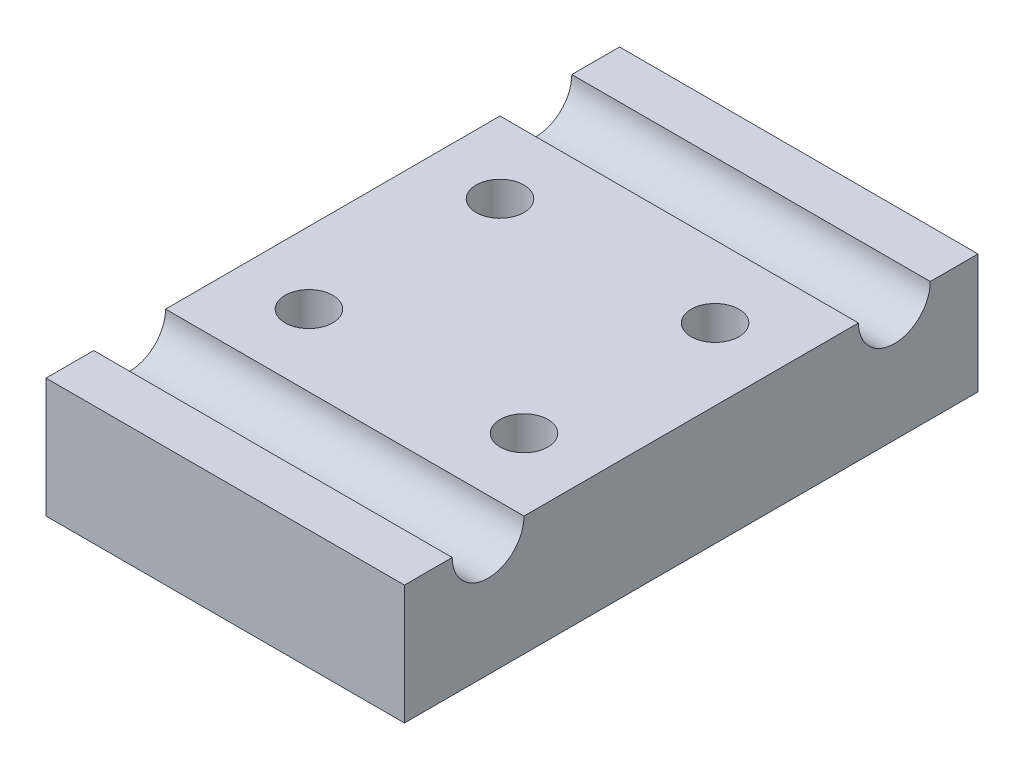
ISO-10303-21;
HEADER;
FILE_DESCRIPTION(('STEP AP214'),'2;1');
FILE_NAME('part.step','',(''),(''),'','','');
FILE_SCHEMA(('AUTOMOTIVE_DESIGN { 1 0 10303 214 1 1 1 1 }'));
ENDSEC;
DATA;
#1=APPLICATION_CONTEXT('core data for automotive mechanical design processes');
#2=APPLICATION_PROTOCOL_DEFINITION('international standard','automotive_design',2000,#1);
#3=PRODUCT_CONTEXT('',#1,'mechanical');
#4=PRODUCT('Part','Part','',(#3));
#5=PRODUCT_RELATED_PRODUCT_CATEGORY('part','',(#4));
#6=PRODUCT_DEFINITION_FORMATION('','',#4);
#7=PRODUCT_DEFINITION_CONTEXT('part definition',#1,'design');
#8=PRODUCT_DEFINITION('design','',#6,#7);
#9=PRODUCT_DEFINITION_SHAPE('','',#8);
#10=(LENGTH_UNIT() NAMED_UNIT(*) SI_UNIT(.MILLI.,.METRE.));
#11=(NAMED_UNIT(*) PLANE_ANGLE_UNIT() SI_UNIT($,.RADIAN.));
#12=(NAMED_UNIT(*) SI_UNIT($,.STERADIAN.) SOLID_ANGLE_UNIT());
#13=UNCERTAINTY_MEASURE_WITH_UNIT(LENGTH_MEASURE(1.E-05),#10,'distance_accuracy_value','');
#14=(GEOMETRIC_REPRESENTATION_CONTEXT(3) GLOBAL_UNCERTAINTY_ASSIGNED_CONTEXT((#13)) GLOBAL_UNIT_ASSIGNED_CONTEXT((#10,
#11,#12)) REPRESENTATION_CONTEXT('',''));
#15=CARTESIAN_POINT('',(0.,0.,0.));
#16=DIRECTION('',(0.,0.,1.));
#17=DIRECTION('',(1.,0.,0.));
#18=AXIS2_PLACEMENT_3D('',#15,#16,#17);
#19=CARTESIAN_POINT('',(0.,10.,48.));
#20=DIRECTION('',(0.,-1.,0.));
#21=DIRECTION('',(0.,0.,-1.));
#22=AXIS2_PLACEMENT_3D('',#19,#20,#21);
#23=PLANE('',#22);
#24=CARTESIAN_POINT('',(6.,10.,31.995));
#25=DIRECTION('',(0.,1.,0.));
#26=DIRECTION('',(0.,0.,1.));
#27=AXIS2_PLACEMENT_3D('',#24,#25,#26);
#28=CIRCLE('',#27,2.);
#29=CARTESIAN_POINT('',(6.,10.,33.995));
#30=VERTEX_POINT('',#29);
#31=EDGE_CURVE('E170',#30,#30,#28,.T.);
#32=ORIENTED_EDGE('',*,*,#31,.F.);
#33=EDGE_LOOP('',(#32));
#34=FACE_BOUND('',#33,.T.);
#35=CARTESIAN_POINT('',(24.,10.,16.005));
#36=DIRECTION('',(0.,1.,0.));
#37=DIRECTION('',(0.,0.,1.));
#38=AXIS2_PLACEMENT_3D('',#35,#36,#37);
#39=CIRCLE('',#38,2.);
#40=CARTESIAN_POINT('',(24.,10.,18.005));
#41=VERTEX_POINT('',#40);
#42=EDGE_CURVE('E163',#41,#41,#39,.T.);
#43=ORIENTED_EDGE('',*,*,#42,.F.);
#44=EDGE_LOOP('',(#43));
#45=FACE_BOUND('',#44,.T.);
#46=CARTESIAN_POINT('',(6.,10.,16.005));
#47=DIRECTION('',(0.,1.,0.));
#48=DIRECTION('',(0.,0.,1.));
#49=AXIS2_PLACEMENT_3D('',#46,#47,#48);
#50=CIRCLE('',#49,2.);
#51=CARTESIAN_POINT('',(6.,10.,18.005));
#52=VERTEX_POINT('',#51);
#53=EDGE_CURVE('E175',#52,#52,#50,.T.);
#54=ORIENTED_EDGE('',*,*,#53,.F.);
#55=EDGE_LOOP('',(#54));
#56=FACE_BOUND('',#55,.T.);
#57=CARTESIAN_POINT('',(24.,10.,31.995));
#58=DIRECTION('',(0.,1.,0.));
#59=DIRECTION('',(0.,0.,1.));
#60=AXIS2_PLACEMENT_3D('',#57,#58,#59);
#61=CIRCLE('',#60,2.00000000000001);
#62=CARTESIAN_POINT('',(24.,10.,33.995));
#63=VERTEX_POINT('',#62);
#64=EDGE_CURVE('E157',#63,#63,#61,.T.);
#65=ORIENTED_EDGE('',*,*,#64,.F.);
#66=EDGE_LOOP('',(#65));
#67=FACE_BOUND('',#66,.T.);
#68=DIRECTION('',(0.,0.,-1.));
#69=VECTOR('',#68,1.);
#70=CARTESIAN_POINT('',(30.,10.,48.));
#71=LINE('',#70,#69);
#72=CARTESIAN_POINT('',(30.,10.,37.995));
#73=VERTEX_POINT('',#72);
#74=CARTESIAN_POINT('',(30.,10.,10.005));
#75=VERTEX_POINT('',#74);
#76=EDGE_CURVE('E127',#73,#75,#71,.T.);
#77=ORIENTED_EDGE('',*,*,#76,.T.);
#78=DIRECTION('',(-1.,0.,0.));
#79=VECTOR('',#78,1.);
#80=CARTESIAN_POINT('',(48.,10.,10.005));
#81=LINE('',#80,#79);
#82=CARTESIAN_POINT('',(0.,10.,10.005));
#83=VERTEX_POINT('',#82);
#84=EDGE_CURVE('E11',#75,#83,#81,.T.);
#85=ORIENTED_EDGE('',*,*,#84,.T.);
#86=DIRECTION('',(0.,0.,-1.));
#87=VECTOR('',#86,1.);
#88=CARTESIAN_POINT('',(0.,10.,48.));
#89=LINE('',#88,#87);
#90=CARTESIAN_POINT('',(0.,10.,37.995));
#91=VERTEX_POINT('',#90);
#92=EDGE_CURVE('E124',#91,#83,#89,.T.);
#93=ORIENTED_EDGE('',*,*,#92,.F.);
#94=DIRECTION('',(-1.,0.,0.));
#95=VECTOR('',#94,1.);
#96=CARTESIAN_POINT('',(48.,10.,37.995));
#97=LINE('',#96,#95);
#98=EDGE_CURVE('E102',#91,#73,#97,.F.);
#99=ORIENTED_EDGE('',*,*,#98,.T.);
#100=EDGE_LOOP('',(#77,#85,#93,#99));
#101=FACE_BOUND('',#100,.T.);
#102=ADVANCED_FACE('F35',(#34,#45,#56,#67,#101),#23,.F.);
#103=CARTESIAN_POINT('',(30.,10.,48.));
#104=VERTEX_POINT('',#103);
#105=CARTESIAN_POINT('',(30.,10.,44.005));
#106=VERTEX_POINT('',#105);
#107=EDGE_CURVE('E118',#104,#106,#71,.T.);
#108=ORIENTED_EDGE('',*,*,#107,.T.);
#109=DIRECTION('',(-1.,0.,0.));
#110=VECTOR('',#109,1.);
#111=CARTESIAN_POINT('',(48.,10.,44.005));
#112=LINE('',#111,#110);
#113=CARTESIAN_POINT('',(0.,10.,44.005));
#114=VERTEX_POINT('',#113);
#115=EDGE_CURVE('E101',#106,#114,#112,.T.);
#116=ORIENTED_EDGE('',*,*,#115,.T.);
#117=CARTESIAN_POINT('',(0.,10.,48.));
#118=VERTEX_POINT('',#117);
#119=EDGE_CURVE('E115',#118,#114,#89,.T.);
#120=ORIENTED_EDGE('',*,*,#119,.F.);
#121=DIRECTION('',(-1.,0.,0.));
#122=VECTOR('',#121,1.);
#123=CARTESIAN_POINT('',(0.,10.,48.));
#124=LINE('',#123,#122);
#125=EDGE_CURVE('E130',#104,#118,#124,.T.);
#126=ORIENTED_EDGE('',*,*,#125,.F.);
#127=EDGE_LOOP('',(#108,#116,#120,#126));
#128=FACE_BOUND('',#127,.T.);
#129=ADVANCED_FACE('F113',(#128),#23,.F.);
#130=CARTESIAN_POINT('',(0.,0.,48.));
#131=DIRECTION('',(1.,0.,0.));
#132=DIRECTION('',(0.,0.,-1.));
#133=AXIS2_PLACEMENT_3D('',#130,#131,#132);
#134=PLANE('',#133);
#135=ORIENTED_EDGE('',*,*,#92,.T.);
#136=CARTESIAN_POINT('',(0.,10.,7.));
#137=DIRECTION('',(-1.,0.,0.));
#138=DIRECTION('',(0.,0.,1.));
#139=AXIS2_PLACEMENT_3D('',#136,#137,#138);
#140=CIRCLE('',#139,3.005);
#141=CARTESIAN_POINT('',(0.,10.,3.995));
#142=VERTEX_POINT('',#141);
#143=EDGE_CURVE('E107',#142,#83,#140,.T.);
#144=ORIENTED_EDGE('',*,*,#143,.F.);
#145=CARTESIAN_POINT('',(0.,10.,0.));
#146=VERTEX_POINT('',#145);
#147=EDGE_CURVE('E126',#142,#146,#89,.T.);
#148=ORIENTED_EDGE('',*,*,#147,.T.);
#149=DIRECTION('',(0.,-1.,0.));
#150=VECTOR('',#149,1.);
#151=CARTESIAN_POINT('',(0.,0.,0.));
#152=LINE('',#151,#150);
#153=CARTESIAN_POINT('',(0.,0.,0.));
#154=VERTEX_POINT('',#153);
#155=EDGE_CURVE('E142',#146,#154,#152,.T.);
#156=ORIENTED_EDGE('',*,*,#155,.T.);
#157=DIRECTION('',(0.,0.,-1.));
#158=VECTOR('',#157,1.);
#159=CARTESIAN_POINT('',(0.,0.,48.));
#160=LINE('',#159,#158);
#161=CARTESIAN_POINT('',(0.,0.,48.));
#162=VERTEX_POINT('',#161);
#163=EDGE_CURVE('E206',#162,#154,#160,.T.);
#164=ORIENTED_EDGE('',*,*,#163,.F.);
#165=DIRECTION('',(0.,-1.,0.));
#166=VECTOR('',#165,1.);
#167=CARTESIAN_POINT('',(0.,0.,48.));
#168=LINE('',#167,#166);
#169=EDGE_CURVE('E122',#118,#162,#168,.T.);
#170=ORIENTED_EDGE('',*,*,#169,.F.);
#171=ORIENTED_EDGE('',*,*,#119,.T.);
#172=CARTESIAN_POINT('',(0.,10.,41.));
#173=DIRECTION('',(-1.,0.,0.));
#174=DIRECTION('',(0.,0.,1.));
#175=AXIS2_PLACEMENT_3D('',#172,#173,#174);
#176=CIRCLE('',#175,3.005);
#177=EDGE_CURVE('E98',#91,#114,#176,.T.);
#178=ORIENTED_EDGE('',*,*,#177,.F.);
#179=EDGE_LOOP('',(#135,#144,#148,#156,#164,#170,#171,#178));
#180=FACE_BOUND('',#179,.T.);
#181=ADVANCED_FACE('F37',(#180),#134,.F.);
#182=CARTESIAN_POINT('',(0.,0.,48.));
#183=DIRECTION('',(0.,1.,0.));
#184=DIRECTION('',(0.,0.,1.));
#185=AXIS2_PLACEMENT_3D('',#182,#183,#184);
#186=PLANE('',#185);
#187=CARTESIAN_POINT('',(6.,0.,31.995));
#188=DIRECTION('',(0.,1.,0.));
#189=DIRECTION('',(0.,0.,1.));
#190=AXIS2_PLACEMENT_3D('',#187,#188,#189);
#191=CIRCLE('',#190,2.);
#192=CARTESIAN_POINT('',(6.,0.,33.995));
#193=VERTEX_POINT('',#192);
#194=EDGE_CURVE('E160',#193,#193,#191,.T.);
#195=ORIENTED_EDGE('',*,*,#194,.T.);
#196=EDGE_LOOP('',(#195));
#197=FACE_BOUND('',#196,.T.);
#198=CARTESIAN_POINT('',(24.,0.,16.005));
#199=DIRECTION('',(0.,1.,0.));
#200=DIRECTION('',(0.,0.,1.));
#201=AXIS2_PLACEMENT_3D('',#198,#199,#200);
#202=CIRCLE('',#201,2.);
#203=CARTESIAN_POINT('',(24.,0.,18.005));
#204=VERTEX_POINT('',#203);
#205=EDGE_CURVE('E166',#204,#204,#202,.T.);
#206=ORIENTED_EDGE('',*,*,#205,.T.);
#207=EDGE_LOOP('',(#206));
#208=FACE_BOUND('',#207,.T.);
#209=CARTESIAN_POINT('',(6.,0.,16.005));
#210=DIRECTION('',(0.,1.,0.));
#211=DIRECTION('',(0.,0.,1.));
#212=AXIS2_PLACEMENT_3D('',#209,#210,#211);
#213=CIRCLE('',#212,2.);
#214=CARTESIAN_POINT('',(6.,0.,18.005));
#215=VERTEX_POINT('',#214);
#216=EDGE_CURVE('E167',#215,#215,#213,.T.);
#217=ORIENTED_EDGE('',*,*,#216,.T.);
#218=EDGE_LOOP('',(#217));
#219=FACE_BOUND('',#218,.T.);
#220=CARTESIAN_POINT('',(24.,0.,31.995));
#221=DIRECTION('',(0.,1.,0.));
#222=DIRECTION('',(0.,0.,1.));
#223=AXIS2_PLACEMENT_3D('',#220,#221,#222);
#224=CIRCLE('',#223,2.00000000000001);
#225=CARTESIAN_POINT('',(24.,0.,33.995));
#226=VERTEX_POINT('',#225);
#227=EDGE_CURVE('E108',#226,#226,#224,.T.);
#228=ORIENTED_EDGE('',*,*,#227,.T.);
#229=EDGE_LOOP('',(#228));
#230=FACE_BOUND('',#229,.T.);
#231=DIRECTION('',(1.,0.,0.));
#232=VECTOR('',#231,1.);
#233=CARTESIAN_POINT('',(0.,0.,0.));
#234=LINE('',#233,#232);
#235=CARTESIAN_POINT('',(30.,0.,0.));
#236=VERTEX_POINT('',#235);
#237=EDGE_CURVE('E144',#154,#236,#234,.T.);
#238=ORIENTED_EDGE('',*,*,#237,.T.);
#239=DIRECTION('',(0.,0.,-1.));
#240=VECTOR('',#239,1.);
#241=CARTESIAN_POINT('',(30.,0.,48.));
#242=LINE('',#241,#240);
#243=CARTESIAN_POINT('',(30.,0.,48.));
#244=VERTEX_POINT('',#243);
#245=EDGE_CURVE('E202',#244,#236,#242,.T.);
#246=ORIENTED_EDGE('',*,*,#245,.F.);
#247=DIRECTION('',(1.,0.,0.));
#248=VECTOR('',#247,1.);
#249=CARTESIAN_POINT('',(0.,0.,48.));
#250=LINE('',#249,#248);
#251=EDGE_CURVE('E138',#162,#244,#250,.T.);
#252=ORIENTED_EDGE('',*,*,#251,.F.);
#253=ORIENTED_EDGE('',*,*,#163,.T.);
#254=EDGE_LOOP('',(#238,#246,#252,#253));
#255=FACE_BOUND('',#254,.T.);
#256=ADVANCED_FACE('F181',(#197,#208,#219,#230,#255),#186,.F.);
#257=CARTESIAN_POINT('',(30.,0.,48.));
#258=DIRECTION('',(-1.,0.,0.));
#259=DIRECTION('',(0.,0.,1.));
#260=AXIS2_PLACEMENT_3D('',#257,#258,#259);
#261=PLANE('',#260);
#262=CARTESIAN_POINT('',(30.,10.,3.995));
#263=VERTEX_POINT('',#262);
#264=CARTESIAN_POINT('',(30.,10.,0.));
#265=VERTEX_POINT('',#264);
#266=EDGE_CURVE('E123',#263,#265,#71,.T.);
#267=ORIENTED_EDGE('',*,*,#266,.F.);
#268=CARTESIAN_POINT('',(30.,10.,7.));
#269=DIRECTION('',(-1.,0.,0.));
#270=DIRECTION('',(0.,0.,1.));
#271=AXIS2_PLACEMENT_3D('',#268,#269,#270);
#272=CIRCLE('',#271,3.005);
#273=EDGE_CURVE('E50',#263,#75,#272,.T.);
#274=ORIENTED_EDGE('',*,*,#273,.T.);
#275=ORIENTED_EDGE('',*,*,#76,.F.);
#276=CARTESIAN_POINT('',(30.,10.,41.));
#277=DIRECTION('',(-1.,0.,0.));
#278=DIRECTION('',(0.,0.,1.));
#279=AXIS2_PLACEMENT_3D('',#276,#277,#278);
#280=CIRCLE('',#279,3.005);
#281=EDGE_CURVE('E58',#73,#106,#280,.T.);
#282=ORIENTED_EDGE('',*,*,#281,.T.);
#283=ORIENTED_EDGE('',*,*,#107,.F.);
#284=DIRECTION('',(0.,1.,0.));
#285=VECTOR('',#284,1.);
#286=CARTESIAN_POINT('',(30.,0.,48.));
#287=LINE('',#286,#285);
#288=EDGE_CURVE('E135',#244,#104,#287,.T.);
#289=ORIENTED_EDGE('',*,*,#288,.F.);
#290=ORIENTED_EDGE('',*,*,#245,.T.);
#291=DIRECTION('',(0.,1.,0.));
#292=VECTOR('',#291,1.);
#293=CARTESIAN_POINT('',(30.,0.,0.));
#294=LINE('',#293,#292);
#295=EDGE_CURVE('E146',#236,#265,#294,.T.);
#296=ORIENTED_EDGE('',*,*,#295,.T.);
#297=EDGE_LOOP('',(#267,#274,#275,#282,#283,#289,#290,#296));
#298=FACE_BOUND('',#297,.T.);
#299=ADVANCED_FACE('F210',(#298),#261,.F.);
#300=ORIENTED_EDGE('',*,*,#147,.F.);
#301=DIRECTION('',(-1.,0.,0.));
#302=VECTOR('',#301,1.);
#303=CARTESIAN_POINT('',(48.,10.,3.995));
#304=LINE('',#303,#302);
#305=EDGE_CURVE('E43',#142,#263,#304,.F.);
#306=ORIENTED_EDGE('',*,*,#305,.T.);
#307=ORIENTED_EDGE('',*,*,#266,.T.);
#308=DIRECTION('',(-1.,0.,0.));
#309=VECTOR('',#308,1.);
#310=CARTESIAN_POINT('',(0.,10.,0.));
#311=LINE('',#310,#309);
#312=EDGE_CURVE('E148',#265,#146,#311,.T.);
#313=ORIENTED_EDGE('',*,*,#312,.T.);
#314=EDGE_LOOP('',(#300,#306,#307,#313));
#315=FACE_BOUND('',#314,.T.);
#316=ADVANCED_FACE('F196',(#315),#23,.F.);
#317=CARTESIAN_POINT('',(0.,0.,48.));
#318=DIRECTION('',(0.,0.,-1.));
#319=DIRECTION('',(-1.,0.,0.));
#320=AXIS2_PLACEMENT_3D('',#317,#318,#319);
#321=PLANE('',#320);
#322=ORIENTED_EDGE('',*,*,#169,.T.);
#323=ORIENTED_EDGE('',*,*,#251,.T.);
#324=ORIENTED_EDGE('',*,*,#288,.T.);
#325=ORIENTED_EDGE('',*,*,#125,.T.);
#326=EDGE_LOOP('',(#322,#323,#324,#325));
#327=FACE_BOUND('',#326,.T.);
#328=ADVANCED_FACE('F217',(#327),#321,.F.);
#329=CARTESIAN_POINT('',(0.,0.,0.));
#330=DIRECTION('',(0.,0.,-1.));
#331=DIRECTION('',(-1.,0.,0.));
#332=AXIS2_PLACEMENT_3D('',#329,#330,#331);
#333=PLANE('',#332);
#334=ORIENTED_EDGE('',*,*,#155,.F.);
#335=ORIENTED_EDGE('',*,*,#312,.F.);
#336=ORIENTED_EDGE('',*,*,#295,.F.);
#337=ORIENTED_EDGE('',*,*,#237,.F.);
#338=EDGE_LOOP('',(#334,#335,#336,#337));
#339=FACE_BOUND('',#338,.T.);
#340=ADVANCED_FACE('F215',(#339),#333,.T.);
#341=CARTESIAN_POINT('',(48.,10.,41.));
#342=DIRECTION('',(-1.,0.,0.));
#343=DIRECTION('',(0.,0.,1.));
#344=AXIS2_PLACEMENT_3D('',#341,#342,#343);
#345=CYLINDRICAL_SURFACE('',#344,3.005);
#346=ORIENTED_EDGE('',*,*,#281,.F.);
#347=ORIENTED_EDGE('',*,*,#98,.F.);
#348=ORIENTED_EDGE('',*,*,#177,.T.);
#349=ORIENTED_EDGE('',*,*,#115,.F.);
#350=EDGE_LOOP('',(#346,#347,#348,#349));
#351=FACE_BOUND('',#350,.T.);
#352=ADVANCED_FACE('F100',(#351),#345,.F.);
#353=CARTESIAN_POINT('',(48.,10.,7.));
#354=DIRECTION('',(-1.,0.,0.));
#355=DIRECTION('',(0.,0.,1.));
#356=AXIS2_PLACEMENT_3D('',#353,#354,#355);
#357=CYLINDRICAL_SURFACE('',#356,3.005);
#358=ORIENTED_EDGE('',*,*,#273,.F.);
#359=ORIENTED_EDGE('',*,*,#305,.F.);
#360=ORIENTED_EDGE('',*,*,#143,.T.);
#361=ORIENTED_EDGE('',*,*,#84,.F.);
#362=EDGE_LOOP('',(#358,#359,#360,#361));
#363=FACE_BOUND('',#362,.T.);
#364=ADVANCED_FACE('F251',(#363),#357,.F.);
#365=CARTESIAN_POINT('',(24.,0.,31.995));
#366=DIRECTION('',(0.,1.,0.));
#367=DIRECTION('',(0.,0.,1.));
#368=AXIS2_PLACEMENT_3D('',#365,#366,#367);
#369=CYLINDRICAL_SURFACE('',#368,2.00000000000001);
#370=ORIENTED_EDGE('',*,*,#227,.F.);
#371=EDGE_LOOP('',(#370));
#372=FACE_BOUND('',#371,.T.);
#373=ORIENTED_EDGE('',*,*,#64,.T.);
#374=EDGE_LOOP('',(#373));
#375=FACE_BOUND('',#374,.T.);
#376=ADVANCED_FACE('F188',(#372,#375),#369,.F.);
#377=CARTESIAN_POINT('',(6.,0.,16.005));
#378=DIRECTION('',(0.,1.,0.));
#379=DIRECTION('',(0.,0.,1.));
#380=AXIS2_PLACEMENT_3D('',#377,#378,#379);
#381=CYLINDRICAL_SURFACE('',#380,2.);
#382=ORIENTED_EDGE('',*,*,#216,.F.);
#383=EDGE_LOOP('',(#382));
#384=FACE_BOUND('',#383,.T.);
#385=ORIENTED_EDGE('',*,*,#53,.T.);
#386=EDGE_LOOP('',(#385));
#387=FACE_BOUND('',#386,.T.);
#388=ADVANCED_FACE('F184',(#384,#387),#381,.F.);
#389=CARTESIAN_POINT('',(24.,0.,16.005));
#390=DIRECTION('',(0.,1.,0.));
#391=DIRECTION('',(0.,0.,1.));
#392=AXIS2_PLACEMENT_3D('',#389,#390,#391);
#393=CYLINDRICAL_SURFACE('',#392,2.);
#394=ORIENTED_EDGE('',*,*,#205,.F.);
#395=EDGE_LOOP('',(#394));
#396=FACE_BOUND('',#395,.T.);
#397=ORIENTED_EDGE('',*,*,#42,.T.);
#398=EDGE_LOOP('',(#397));
#399=FACE_BOUND('',#398,.T.);
#400=ADVANCED_FACE('F187',(#396,#399),#393,.F.);
#401=CARTESIAN_POINT('',(6.,0.,31.995));
#402=DIRECTION('',(0.,1.,0.));
#403=DIRECTION('',(0.,0.,1.));
#404=AXIS2_PLACEMENT_3D('',#401,#402,#403);
#405=CYLINDRICAL_SURFACE('',#404,2.);
#406=ORIENTED_EDGE('',*,*,#194,.F.);
#407=EDGE_LOOP('',(#406));
#408=FACE_BOUND('',#407,.T.);
#409=ORIENTED_EDGE('',*,*,#31,.T.);
#410=EDGE_LOOP('',(#409));
#411=FACE_BOUND('',#410,.T.);
#412=ADVANCED_FACE('F240',(#408,#411),#405,.F.);
#413=CLOSED_SHELL('',(#102,#129,#181,#256,#299,#316,#328,#340,#352,#364,#376,#388,#400,#412));
#414=MANIFOLD_SOLID_BREP('B2',#413);
#415=ADVANCED_BREP_SHAPE_REPRESENTATION('',(#18,#414),#14);
#416=SHAPE_DEFINITION_REPRESENTATION(#9,#415);
ENDSEC;
END-ISO-10303-21;
